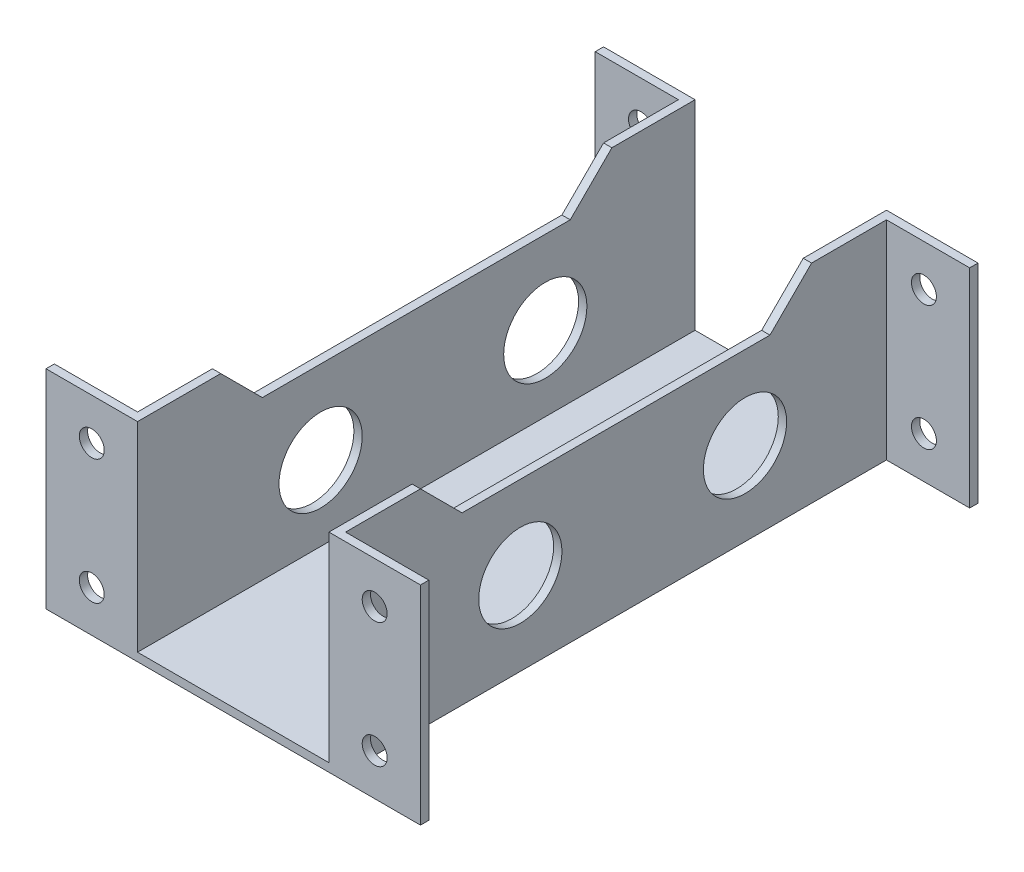
ISO-10303-21;
HEADER;
FILE_DESCRIPTION(('STEP AP214'),'2;1');
FILE_NAME('part.step','',(''),(''),'','','');
FILE_SCHEMA(('AUTOMOTIVE_DESIGN { 1 0 10303 214 1 1 1 1 }'));
ENDSEC;
DATA;
#1=APPLICATION_CONTEXT('core data for automotive mechanical design processes');
#2=APPLICATION_PROTOCOL_DEFINITION('international standard','automotive_design',2000,#1);
#3=PRODUCT_CONTEXT('',#1,'mechanical');
#4=PRODUCT('Part','Part','',(#3));
#5=PRODUCT_RELATED_PRODUCT_CATEGORY('part','',(#4));
#6=PRODUCT_DEFINITION_FORMATION('','',#4);
#7=PRODUCT_DEFINITION_CONTEXT('part definition',#1,'design');
#8=PRODUCT_DEFINITION('design','',#6,#7);
#9=PRODUCT_DEFINITION_SHAPE('','',#8);
#10=(LENGTH_UNIT() NAMED_UNIT(*) SI_UNIT(.MILLI.,.METRE.));
#11=(NAMED_UNIT(*) PLANE_ANGLE_UNIT() SI_UNIT($,.RADIAN.));
#12=(NAMED_UNIT(*) SI_UNIT($,.STERADIAN.) SOLID_ANGLE_UNIT());
#13=UNCERTAINTY_MEASURE_WITH_UNIT(LENGTH_MEASURE(1.E-05),#10,'distance_accuracy_value','');
#14=(GEOMETRIC_REPRESENTATION_CONTEXT(3) GLOBAL_UNCERTAINTY_ASSIGNED_CONTEXT((#13)) GLOBAL_UNIT_ASSIGNED_CONTEXT((#10,
#11,#12)) REPRESENTATION_CONTEXT('',''));
#15=CARTESIAN_POINT('',(0.,0.,0.));
#16=DIRECTION('',(0.,0.,1.));
#17=DIRECTION('',(1.,0.,0.));
#18=AXIS2_PLACEMENT_3D('',#15,#16,#17);
#19=CARTESIAN_POINT('',(0.,25.,0.));
#20=DIRECTION('',(0.,-1.,0.));
#21=DIRECTION('',(0.,0.,-1.));
#22=AXIS2_PLACEMENT_3D('',#19,#20,#21);
#23=PLANE('',#22);
#24=DIRECTION('',(0.,0.,-1.));
#25=VECTOR('',#24,1.);
#26=CARTESIAN_POINT('',(12.5,25.,-33.5));
#27=LINE('',#26,#25);
#28=CARTESIAN_POINT('',(12.5,25.,32.5));
#29=VERTEX_POINT('',#28);
#30=CARTESIAN_POINT('',(12.5,25.,23.5));
#31=VERTEX_POINT('',#30);
#32=EDGE_CURVE('E248',#29,#31,#27,.T.);
#33=ORIENTED_EDGE('',*,*,#32,.T.);
#34=DIRECTION('',(1.,0.,0.));
#35=VECTOR('',#34,1.);
#36=CARTESIAN_POINT('',(-22.500025,25.,23.5));
#37=LINE('',#36,#35);
#38=CARTESIAN_POINT('',(11.5,25.,23.5));
#39=VERTEX_POINT('',#38);
#40=EDGE_CURVE('E373',#39,#31,#37,.T.);
#41=ORIENTED_EDGE('',*,*,#40,.F.);
#42=DIRECTION('',(0.,0.,1.));
#43=VECTOR('',#42,1.);
#44=CARTESIAN_POINT('',(11.5,25.,-33.5));
#45=LINE('',#44,#43);
#46=CARTESIAN_POINT('',(11.5,25.,33.5));
#47=VERTEX_POINT('',#46);
#48=EDGE_CURVE('E489',#39,#47,#45,.T.);
#49=ORIENTED_EDGE('',*,*,#48,.T.);
#50=DIRECTION('',(1.,0.,0.));
#51=VECTOR('',#50,1.);
#52=CARTESIAN_POINT('',(12.5,25.,33.5));
#53=LINE('',#52,#51);
#54=CARTESIAN_POINT('',(22.5,25.,33.5));
#55=VERTEX_POINT('',#54);
#56=EDGE_CURVE('E357',#47,#55,#53,.T.);
#57=ORIENTED_EDGE('',*,*,#56,.T.);
#58=DIRECTION('',(0.,0.,1.));
#59=VECTOR('',#58,1.);
#60=CARTESIAN_POINT('',(22.5,25.,33.5));
#61=LINE('',#60,#59);
#62=CARTESIAN_POINT('',(22.5,25.,32.5));
#63=VERTEX_POINT('',#62);
#64=EDGE_CURVE('E275',#63,#55,#61,.T.);
#65=ORIENTED_EDGE('',*,*,#64,.F.);
#66=DIRECTION('',(-1.,0.,0.));
#67=VECTOR('',#66,1.);
#68=CARTESIAN_POINT('',(22.5,25.,32.5));
#69=LINE('',#68,#67);
#70=EDGE_CURVE('E271',#63,#29,#69,.T.);
#71=ORIENTED_EDGE('',*,*,#70,.T.);
#72=EDGE_LOOP('',(#33,#41,#49,#57,#65,#71));
#73=FACE_BOUND('',#72,.T.);
#74=ADVANCED_FACE('F32',(#73),#23,.F.);
#75=CARTESIAN_POINT('',(0.,25.,0.));
#76=DIRECTION('',(0.,1.,0.));
#77=DIRECTION('',(0.,0.,1.));
#78=AXIS2_PLACEMENT_3D('',#75,#76,#77);
#79=PLANE('',#78);
#80=DIRECTION('',(1.,0.,0.));
#81=VECTOR('',#80,1.);
#82=CARTESIAN_POINT('',(0.,25.,23.5));
#83=LINE('',#82,#81);
#84=CARTESIAN_POINT('',(-12.5,25.,23.5));
#85=VERTEX_POINT('',#84);
#86=CARTESIAN_POINT('',(-11.5,25.,23.5));
#87=VERTEX_POINT('',#86);
#88=EDGE_CURVE('E41',#85,#87,#83,.T.);
#89=ORIENTED_EDGE('',*,*,#88,.F.);
#90=DIRECTION('',(0.,0.,1.));
#91=VECTOR('',#90,1.);
#92=CARTESIAN_POINT('',(-12.5,25.,-33.5));
#93=LINE('',#92,#91);
#94=CARTESIAN_POINT('',(-12.5,25.,32.5));
#95=VERTEX_POINT('',#94);
#96=EDGE_CURVE('E220',#85,#95,#93,.T.);
#97=ORIENTED_EDGE('',*,*,#96,.T.);
#98=DIRECTION('',(1.,0.,0.));
#99=VECTOR('',#98,1.);
#100=CARTESIAN_POINT('',(-22.5,25.,32.5));
#101=LINE('',#100,#99);
#102=CARTESIAN_POINT('',(-22.5,25.,32.5));
#103=VERTEX_POINT('',#102);
#104=EDGE_CURVE('E315',#103,#95,#101,.T.);
#105=ORIENTED_EDGE('',*,*,#104,.F.);
#106=DIRECTION('',(0.,0.,-1.));
#107=VECTOR('',#106,1.);
#108=CARTESIAN_POINT('',(-22.5,25.,33.5));
#109=LINE('',#108,#107);
#110=CARTESIAN_POINT('',(-22.5,25.,33.5));
#111=VERTEX_POINT('',#110);
#112=EDGE_CURVE('E444',#111,#103,#109,.T.);
#113=ORIENTED_EDGE('',*,*,#112,.F.);
#114=DIRECTION('',(1.,0.,0.));
#115=VECTOR('',#114,1.);
#116=CARTESIAN_POINT('',(-12.5,25.,33.5));
#117=LINE('',#116,#115);
#118=CARTESIAN_POINT('',(-11.5,25.,33.5));
#119=VERTEX_POINT('',#118);
#120=EDGE_CURVE('E219',#111,#119,#117,.T.);
#121=ORIENTED_EDGE('',*,*,#120,.T.);
#122=DIRECTION('',(0.,0.,-1.));
#123=VECTOR('',#122,1.);
#124=CARTESIAN_POINT('',(-11.5,25.,-33.5));
#125=LINE('',#124,#123);
#126=EDGE_CURVE('E296',#119,#87,#125,.T.);
#127=ORIENTED_EDGE('',*,*,#126,.T.);
#128=EDGE_LOOP('',(#89,#97,#105,#113,#121,#127));
#129=FACE_BOUND('',#128,.T.);
#130=ADVANCED_FACE('F560',(#129),#79,.T.);
#131=CARTESIAN_POINT('',(-12.5,1.,33.5));
#132=DIRECTION('',(1.,0.,0.));
#133=DIRECTION('',(0.,0.,-1.));
#134=AXIS2_PLACEMENT_3D('',#131,#132,#133);
#135=PLANE('',#134);
#136=CARTESIAN_POINT('',(-12.5,10.,-15.5));
#137=DIRECTION('',(1.,0.,0.));
#138=DIRECTION('',(0.,0.,-1.));
#139=AXIS2_PLACEMENT_3D('',#136,#137,#138);
#140=CIRCLE('',#139,5.);
#141=CARTESIAN_POINT('',(-12.5,10.,-20.5));
#142=VERTEX_POINT('',#141);
#143=EDGE_CURVE('E536',#142,#142,#140,.T.);
#144=ORIENTED_EDGE('',*,*,#143,.T.);
#145=EDGE_LOOP('',(#144));
#146=FACE_BOUND('',#145,.T.);
#147=CARTESIAN_POINT('',(-12.5,10.,11.5));
#148=DIRECTION('',(1.,0.,0.));
#149=DIRECTION('',(0.,0.,-1.));
#150=AXIS2_PLACEMENT_3D('',#147,#148,#149);
#151=CIRCLE('',#150,5.);
#152=CARTESIAN_POINT('',(-12.5,10.,6.49999999999999));
#153=VERTEX_POINT('',#152);
#154=EDGE_CURVE('E518',#153,#153,#151,.T.);
#155=ORIENTED_EDGE('',*,*,#154,.T.);
#156=EDGE_LOOP('',(#155));
#157=FACE_BOUND('',#156,.T.);
#158=ORIENTED_EDGE('',*,*,#96,.F.);
#159=DIRECTION('',(0.,-0.707106781186549,-0.707106781186546));
#160=VECTOR('',#159,1.);
#161=CARTESIAN_POINT('',(-12.5,18.,16.5));
#162=LINE('',#161,#160);
#163=CARTESIAN_POINT('',(-12.5,20.,18.5));
#164=VERTEX_POINT('',#163);
#165=EDGE_CURVE('E383',#85,#164,#162,.T.);
#166=ORIENTED_EDGE('',*,*,#165,.T.);
#167=DIRECTION('',(0.,0.,-1.));
#168=VECTOR('',#167,1.);
#169=CARTESIAN_POINT('',(-12.5,20.,33.5));
#170=LINE('',#169,#168);
#171=CARTESIAN_POINT('',(-12.5,20.,-18.5));
#172=VERTEX_POINT('',#171);
#173=EDGE_CURVE('E211',#164,#172,#170,.T.);
#174=ORIENTED_EDGE('',*,*,#173,.T.);
#175=DIRECTION('',(0.,0.707106781186546,-0.707106781186549));
#176=VECTOR('',#175,1.);
#177=CARTESIAN_POINT('',(-12.5,-15.5,17.0000000000001));
#178=LINE('',#177,#176);
#179=CARTESIAN_POINT('',(-12.5,25.,-23.5));
#180=VERTEX_POINT('',#179);
#181=EDGE_CURVE('E197',#172,#180,#178,.T.);
#182=ORIENTED_EDGE('',*,*,#181,.T.);
#183=CARTESIAN_POINT('',(-12.5,25.,-32.5));
#184=VERTEX_POINT('',#183);
#185=EDGE_CURVE('E208',#184,#180,#93,.T.);
#186=ORIENTED_EDGE('',*,*,#185,.F.);
#187=DIRECTION('',(0.,1.,0.));
#188=VECTOR('',#187,1.);
#189=CARTESIAN_POINT('',(-12.5,25.,-32.5));
#190=LINE('',#189,#188);
#191=CARTESIAN_POINT('',(-12.5,0.,-32.5));
#192=VERTEX_POINT('',#191);
#193=EDGE_CURVE('E232',#192,#184,#190,.T.);
#194=ORIENTED_EDGE('',*,*,#193,.F.);
#195=DIRECTION('',(0.,0.,1.));
#196=VECTOR('',#195,1.);
#197=CARTESIAN_POINT('',(-12.5,0.,33.5));
#198=LINE('',#197,#196);
#199=CARTESIAN_POINT('',(-12.5,0.,32.5));
#200=VERTEX_POINT('',#199);
#201=EDGE_CURVE('E229',#192,#200,#198,.T.);
#202=ORIENTED_EDGE('',*,*,#201,.T.);
#203=DIRECTION('',(0.,-1.,0.));
#204=VECTOR('',#203,1.);
#205=CARTESIAN_POINT('',(-12.5,25.,32.5));
#206=LINE('',#205,#204);
#207=EDGE_CURVE('E445',#95,#200,#206,.T.);
#208=ORIENTED_EDGE('',*,*,#207,.F.);
#209=EDGE_LOOP('',(#158,#166,#174,#182,#186,#194,#202,#208));
#210=FACE_BOUND('',#209,.T.);
#211=ADVANCED_FACE('F207',(#146,#157,#210),#135,.F.);
#212=CARTESIAN_POINT('',(12.5,1.,33.5));
#213=DIRECTION('',(-1.,0.,0.));
#214=DIRECTION('',(0.,0.,1.));
#215=AXIS2_PLACEMENT_3D('',#212,#213,#214);
#216=PLANE('',#215);
#217=CARTESIAN_POINT('',(12.5,10.,-15.5));
#218=DIRECTION('',(1.,0.,0.));
#219=DIRECTION('',(0.,0.,-1.));
#220=AXIS2_PLACEMENT_3D('',#217,#218,#219);
#221=CIRCLE('',#220,5.);
#222=CARTESIAN_POINT('',(12.5,10.,-20.5));
#223=VERTEX_POINT('',#222);
#224=EDGE_CURVE('E542',#223,#223,#221,.T.);
#225=ORIENTED_EDGE('',*,*,#224,.F.);
#226=EDGE_LOOP('',(#225));
#227=FACE_BOUND('',#226,.T.);
#228=CARTESIAN_POINT('',(12.5,10.,11.5));
#229=DIRECTION('',(1.,0.,0.));
#230=DIRECTION('',(0.,0.,-1.));
#231=AXIS2_PLACEMENT_3D('',#228,#229,#230);
#232=CIRCLE('',#231,5.);
#233=CARTESIAN_POINT('',(12.5,10.,6.49999999999999));
#234=VERTEX_POINT('',#233);
#235=EDGE_CURVE('E532',#234,#234,#232,.T.);
#236=ORIENTED_EDGE('',*,*,#235,.F.);
#237=EDGE_LOOP('',(#236));
#238=FACE_BOUND('',#237,.T.);
#239=DIRECTION('',(0.,0.,1.));
#240=VECTOR('',#239,1.);
#241=CARTESIAN_POINT('',(12.5,20.,33.5));
#242=LINE('',#241,#240);
#243=CARTESIAN_POINT('',(12.5,20.,-18.5));
#244=VERTEX_POINT('',#243);
#245=CARTESIAN_POINT('',(12.5,20.,18.5));
#246=VERTEX_POINT('',#245);
#247=EDGE_CURVE('E379',#244,#246,#242,.T.);
#248=ORIENTED_EDGE('',*,*,#247,.T.);
#249=DIRECTION('',(0.,0.707106781186549,0.707106781186546));
#250=VECTOR('',#249,1.);
#251=CARTESIAN_POINT('',(12.5,18.,16.5));
#252=LINE('',#251,#250);
#253=EDGE_CURVE('E378',#246,#31,#252,.T.);
#254=ORIENTED_EDGE('',*,*,#253,.T.);
#255=ORIENTED_EDGE('',*,*,#32,.F.);
#256=DIRECTION('',(0.,1.,0.));
#257=VECTOR('',#256,1.);
#258=CARTESIAN_POINT('',(12.5,25.,32.5));
#259=LINE('',#258,#257);
#260=CARTESIAN_POINT('',(12.5,0.,32.5));
#261=VERTEX_POINT('',#260);
#262=EDGE_CURVE('E266',#261,#29,#259,.T.);
#263=ORIENTED_EDGE('',*,*,#262,.F.);
#264=DIRECTION('',(0.,0.,-1.));
#265=VECTOR('',#264,1.);
#266=CARTESIAN_POINT('',(12.5,0.,33.5));
#267=LINE('',#266,#265);
#268=CARTESIAN_POINT('',(12.5,0.,-32.5));
#269=VERTEX_POINT('',#268);
#270=EDGE_CURVE('E263',#261,#269,#267,.T.);
#271=ORIENTED_EDGE('',*,*,#270,.T.);
#272=DIRECTION('',(0.,-1.,0.));
#273=VECTOR('',#272,1.);
#274=CARTESIAN_POINT('',(12.5,25.,-32.5));
#275=LINE('',#274,#273);
#276=CARTESIAN_POINT('',(12.5,25.,-32.5));
#277=VERTEX_POINT('',#276);
#278=EDGE_CURVE('E327',#277,#269,#275,.T.);
#279=ORIENTED_EDGE('',*,*,#278,.F.);
#280=CARTESIAN_POINT('',(12.5,25.,-23.5));
#281=VERTEX_POINT('',#280);
#282=EDGE_CURVE('E246',#281,#277,#27,.T.);
#283=ORIENTED_EDGE('',*,*,#282,.F.);
#284=DIRECTION('',(0.,-0.707106781186546,0.707106781186549));
#285=VECTOR('',#284,1.);
#286=CARTESIAN_POINT('',(12.5,-15.5,17.0000000000001));
#287=LINE('',#286,#285);
#288=EDGE_CURVE('E49',#281,#244,#287,.T.);
#289=ORIENTED_EDGE('',*,*,#288,.T.);
#290=EDGE_LOOP('',(#248,#254,#255,#263,#271,#279,#283,#289));
#291=FACE_BOUND('',#290,.T.);
#292=ADVANCED_FACE('F34',(#227,#238,#291),#216,.F.);
#293=CARTESIAN_POINT('',(0.,1.,0.));
#294=DIRECTION('',(0.,-1.,0.));
#295=DIRECTION('',(0.,0.,-1.));
#296=AXIS2_PLACEMENT_3D('',#293,#294,#295);
#297=PLANE('',#296);
#298=CARTESIAN_POINT('',(0.,1.,-15.5));
#299=DIRECTION('',(0.,1.,0.));
#300=DIRECTION('',(0.,0.,1.));
#301=AXIS2_PLACEMENT_3D('',#298,#299,#300);
#302=CIRCLE('',#301,5.);
#303=CARTESIAN_POINT('',(0.,1.,-10.5));
#304=VERTEX_POINT('',#303);
#305=EDGE_CURVE('E435',#304,#304,#302,.T.);
#306=ORIENTED_EDGE('',*,*,#305,.F.);
#307=EDGE_LOOP('',(#306));
#308=FACE_BOUND('',#307,.T.);
#309=CARTESIAN_POINT('',(0.,1.,11.5));
#310=DIRECTION('',(0.,1.,0.));
#311=DIRECTION('',(0.,0.,1.));
#312=AXIS2_PLACEMENT_3D('',#309,#310,#311);
#313=CIRCLE('',#312,5.);
#314=CARTESIAN_POINT('',(0.,1.,16.5));
#315=VERTEX_POINT('',#314);
#316=EDGE_CURVE('E439',#315,#315,#313,.T.);
#317=ORIENTED_EDGE('',*,*,#316,.F.);
#318=EDGE_LOOP('',(#317));
#319=FACE_BOUND('',#318,.T.);
#320=DIRECTION('',(0.,0.,-1.));
#321=VECTOR('',#320,1.);
#322=CARTESIAN_POINT('',(-11.5,1.,-33.5));
#323=LINE('',#322,#321);
#324=CARTESIAN_POINT('',(-11.5,1.,33.5));
#325=VERTEX_POINT('',#324);
#326=CARTESIAN_POINT('',(-11.5,1.,-33.5));
#327=VERTEX_POINT('',#326);
#328=EDGE_CURVE('E224',#325,#327,#323,.T.);
#329=ORIENTED_EDGE('',*,*,#328,.F.);
#330=DIRECTION('',(1.,0.,0.));
#331=VECTOR('',#330,1.);
#332=CARTESIAN_POINT('',(-12.5,1.,33.5));
#333=LINE('',#332,#331);
#334=CARTESIAN_POINT('',(11.5,1.,33.5));
#335=VERTEX_POINT('',#334);
#336=EDGE_CURVE('E202',#325,#335,#333,.T.);
#337=ORIENTED_EDGE('',*,*,#336,.T.);
#338=DIRECTION('',(0.,0.,1.));
#339=VECTOR('',#338,1.);
#340=CARTESIAN_POINT('',(11.5,1.,-33.5));
#341=LINE('',#340,#339);
#342=CARTESIAN_POINT('',(11.5,1.,-33.5));
#343=VERTEX_POINT('',#342);
#344=EDGE_CURVE('E249',#343,#335,#341,.T.);
#345=ORIENTED_EDGE('',*,*,#344,.F.);
#346=DIRECTION('',(-1.,0.,0.));
#347=VECTOR('',#346,1.);
#348=CARTESIAN_POINT('',(-12.5,1.,-33.5));
#349=LINE('',#348,#347);
#350=EDGE_CURVE('E366',#343,#327,#349,.T.);
#351=ORIENTED_EDGE('',*,*,#350,.T.);
#352=EDGE_LOOP('',(#329,#337,#345,#351));
#353=FACE_BOUND('',#352,.T.);
#354=ADVANCED_FACE('F566',(#308,#319,#353),#297,.F.);
#355=CARTESIAN_POINT('',(-12.5,1.,-33.5));
#356=DIRECTION('',(0.,0.,1.));
#357=DIRECTION('',(1.,0.,0.));
#358=AXIS2_PLACEMENT_3D('',#355,#356,#357);
#359=PLANE('',#358);
#360=CARTESIAN_POINT('',(17.,20.,-33.5));
#361=DIRECTION('',(0.,0.,1.));
#362=DIRECTION('',(1.,0.,0.));
#363=AXIS2_PLACEMENT_3D('',#360,#361,#362);
#364=CIRCLE('',#363,1.5);
#365=CARTESIAN_POINT('',(18.5,20.,-33.5));
#366=VERTEX_POINT('',#365);
#367=EDGE_CURVE('E402',#366,#366,#364,.T.);
#368=ORIENTED_EDGE('',*,*,#367,.T.);
#369=EDGE_LOOP('',(#368));
#370=FACE_BOUND('',#369,.T.);
#371=CARTESIAN_POINT('',(17.,5.,-33.5));
#372=DIRECTION('',(0.,0.,1.));
#373=DIRECTION('',(1.,0.,0.));
#374=AXIS2_PLACEMENT_3D('',#371,#372,#373);
#375=CIRCLE('',#374,1.5);
#376=CARTESIAN_POINT('',(18.5,5.,-33.5));
#377=VERTEX_POINT('',#376);
#378=EDGE_CURVE('E412',#377,#377,#375,.T.);
#379=ORIENTED_EDGE('',*,*,#378,.T.);
#380=EDGE_LOOP('',(#379));
#381=FACE_BOUND('',#380,.T.);
#382=CARTESIAN_POINT('',(-17.,20.,-33.5));
#383=DIRECTION('',(0.,0.,1.));
#384=DIRECTION('',(1.,0.,0.));
#385=AXIS2_PLACEMENT_3D('',#382,#383,#384);
#386=CIRCLE('',#385,1.5);
#387=CARTESIAN_POINT('',(-15.5,20.,-33.5));
#388=VERTEX_POINT('',#387);
#389=EDGE_CURVE('E422',#388,#388,#386,.T.);
#390=ORIENTED_EDGE('',*,*,#389,.T.);
#391=EDGE_LOOP('',(#390));
#392=FACE_BOUND('',#391,.T.);
#393=CARTESIAN_POINT('',(-17.,5.,-33.5));
#394=DIRECTION('',(0.,0.,1.));
#395=DIRECTION('',(1.,0.,0.));
#396=AXIS2_PLACEMENT_3D('',#393,#394,#395);
#397=CIRCLE('',#396,1.5);
#398=CARTESIAN_POINT('',(-15.5,5.,-33.5));
#399=VERTEX_POINT('',#398);
#400=EDGE_CURVE('E432',#399,#399,#397,.T.);
#401=ORIENTED_EDGE('',*,*,#400,.T.);
#402=EDGE_LOOP('',(#401));
#403=FACE_BOUND('',#402,.T.);
#404=DIRECTION('',(-1.,0.,0.));
#405=VECTOR('',#404,1.);
#406=CARTESIAN_POINT('',(-12.5,0.,-33.5));
#407=LINE('',#406,#405);
#408=CARTESIAN_POINT('',(22.5,0.,-33.5));
#409=VERTEX_POINT('',#408);
#410=CARTESIAN_POINT('',(-22.5,0.,-33.5));
#411=VERTEX_POINT('',#410);
#412=EDGE_CURVE('E308',#409,#411,#407,.T.);
#413=ORIENTED_EDGE('',*,*,#412,.T.);
#414=DIRECTION('',(0.,-1.,0.));
#415=VECTOR('',#414,1.);
#416=CARTESIAN_POINT('',(-22.5,25.,-33.5));
#417=LINE('',#416,#415);
#418=CARTESIAN_POINT('',(-22.5,25.,-33.5));
#419=VERTEX_POINT('',#418);
#420=EDGE_CURVE('E306',#419,#411,#417,.T.);
#421=ORIENTED_EDGE('',*,*,#420,.F.);
#422=DIRECTION('',(-1.,0.,0.));
#423=VECTOR('',#422,1.);
#424=CARTESIAN_POINT('',(-12.5,25.,-33.5));
#425=LINE('',#424,#423);
#426=CARTESIAN_POINT('',(-11.5,25.,-33.5));
#427=VERTEX_POINT('',#426);
#428=EDGE_CURVE('E291',#427,#419,#425,.T.);
#429=ORIENTED_EDGE('',*,*,#428,.F.);
#430=DIRECTION('',(0.,-1.,0.));
#431=VECTOR('',#430,1.);
#432=CARTESIAN_POINT('',(-11.5,25.,-33.5));
#433=LINE('',#432,#431);
#434=EDGE_CURVE('E292',#427,#327,#433,.T.);
#435=ORIENTED_EDGE('',*,*,#434,.T.);
#436=ORIENTED_EDGE('',*,*,#350,.F.);
#437=DIRECTION('',(0.,-1.,0.));
#438=VECTOR('',#437,1.);
#439=CARTESIAN_POINT('',(11.5,25.,-33.5));
#440=LINE('',#439,#438);
#441=CARTESIAN_POINT('',(11.5,25.,-33.5));
#442=VERTEX_POINT('',#441);
#443=EDGE_CURVE('E466',#442,#343,#440,.T.);
#444=ORIENTED_EDGE('',*,*,#443,.F.);
#445=DIRECTION('',(-1.,0.,0.));
#446=VECTOR('',#445,1.);
#447=CARTESIAN_POINT('',(12.5,25.,-33.5));
#448=LINE('',#447,#446);
#449=CARTESIAN_POINT('',(22.5,25.,-33.5));
#450=VERTEX_POINT('',#449);
#451=EDGE_CURVE('E256',#450,#442,#448,.T.);
#452=ORIENTED_EDGE('',*,*,#451,.F.);
#453=DIRECTION('',(0.,1.,0.));
#454=VECTOR('',#453,1.);
#455=CARTESIAN_POINT('',(22.5,25.,-33.5));
#456=LINE('',#455,#454);
#457=EDGE_CURVE('E323',#409,#450,#456,.T.);
#458=ORIENTED_EDGE('',*,*,#457,.F.);
#459=EDGE_LOOP('',(#413,#421,#429,#435,#436,#444,#452,#458));
#460=FACE_BOUND('',#459,.T.);
#461=ADVANCED_FACE('F304',(#370,#381,#392,#403,#460),#359,.F.);
#462=CARTESIAN_POINT('',(-12.5,1.,33.5));
#463=DIRECTION('',(0.,0.,-1.));
#464=DIRECTION('',(-1.,0.,0.));
#465=AXIS2_PLACEMENT_3D('',#462,#463,#464);
#466=PLANE('',#465);
#467=CARTESIAN_POINT('',(17.,20.,33.5));
#468=DIRECTION('',(0.,0.,1.));
#469=DIRECTION('',(1.,0.,0.));
#470=AXIS2_PLACEMENT_3D('',#467,#468,#469);
#471=CIRCLE('',#470,1.5);
#472=CARTESIAN_POINT('',(18.5,20.,33.5));
#473=VERTEX_POINT('',#472);
#474=EDGE_CURVE('E396',#473,#473,#471,.T.);
#475=ORIENTED_EDGE('',*,*,#474,.F.);
#476=EDGE_LOOP('',(#475));
#477=FACE_BOUND('',#476,.T.);
#478=CARTESIAN_POINT('',(17.,5.,33.5));
#479=DIRECTION('',(0.,0.,1.));
#480=DIRECTION('',(1.,0.,0.));
#481=AXIS2_PLACEMENT_3D('',#478,#479,#480);
#482=CIRCLE('',#481,1.5);
#483=CARTESIAN_POINT('',(18.5,5.,33.5));
#484=VERTEX_POINT('',#483);
#485=EDGE_CURVE('E405',#484,#484,#482,.T.);
#486=ORIENTED_EDGE('',*,*,#485,.F.);
#487=EDGE_LOOP('',(#486));
#488=FACE_BOUND('',#487,.T.);
#489=CARTESIAN_POINT('',(-17.,20.,33.5));
#490=DIRECTION('',(0.,0.,1.));
#491=DIRECTION('',(1.,0.,0.));
#492=AXIS2_PLACEMENT_3D('',#489,#490,#491);
#493=CIRCLE('',#492,1.5);
#494=CARTESIAN_POINT('',(-15.5,20.,33.5));
#495=VERTEX_POINT('',#494);
#496=EDGE_CURVE('E415',#495,#495,#493,.T.);
#497=ORIENTED_EDGE('',*,*,#496,.F.);
#498=EDGE_LOOP('',(#497));
#499=FACE_BOUND('',#498,.T.);
#500=CARTESIAN_POINT('',(-17.,5.,33.5));
#501=DIRECTION('',(0.,0.,1.));
#502=DIRECTION('',(1.,0.,0.));
#503=AXIS2_PLACEMENT_3D('',#500,#501,#502);
#504=CIRCLE('',#503,1.5);
#505=CARTESIAN_POINT('',(-15.5,5.,33.5));
#506=VERTEX_POINT('',#505);
#507=EDGE_CURVE('E425',#506,#506,#504,.T.);
#508=ORIENTED_EDGE('',*,*,#507,.F.);
#509=EDGE_LOOP('',(#508));
#510=FACE_BOUND('',#509,.T.);
#511=DIRECTION('',(1.,0.,0.));
#512=VECTOR('',#511,1.);
#513=CARTESIAN_POINT('',(-12.5,0.,33.5));
#514=LINE('',#513,#512);
#515=CARTESIAN_POINT('',(-22.5,0.,33.5));
#516=VERTEX_POINT('',#515);
#517=CARTESIAN_POINT('',(22.5,0.,33.5));
#518=VERTEX_POINT('',#517);
#519=EDGE_CURVE('E359',#516,#518,#514,.T.);
#520=ORIENTED_EDGE('',*,*,#519,.T.);
#521=DIRECTION('',(0.,-1.,0.));
#522=VECTOR('',#521,1.);
#523=CARTESIAN_POINT('',(22.5,25.,33.5));
#524=LINE('',#523,#522);
#525=EDGE_CURVE('E269',#55,#518,#524,.T.);
#526=ORIENTED_EDGE('',*,*,#525,.F.);
#527=ORIENTED_EDGE('',*,*,#56,.F.);
#528=DIRECTION('',(0.,-1.,0.));
#529=VECTOR('',#528,1.);
#530=CARTESIAN_POINT('',(11.5,25.,33.5));
#531=LINE('',#530,#529);
#532=EDGE_CURVE('E484',#47,#335,#531,.T.);
#533=ORIENTED_EDGE('',*,*,#532,.T.);
#534=ORIENTED_EDGE('',*,*,#336,.F.);
#535=DIRECTION('',(0.,-1.,0.));
#536=VECTOR('',#535,1.);
#537=CARTESIAN_POINT('',(-11.5,25.,33.5));
#538=LINE('',#537,#536);
#539=EDGE_CURVE('E254',#119,#325,#538,.T.);
#540=ORIENTED_EDGE('',*,*,#539,.F.);
#541=ORIENTED_EDGE('',*,*,#120,.F.);
#542=DIRECTION('',(0.,1.,0.));
#543=VECTOR('',#542,1.);
#544=CARTESIAN_POINT('',(-22.5,25.,33.5));
#545=LINE('',#544,#543);
#546=EDGE_CURVE('E362',#516,#111,#545,.T.);
#547=ORIENTED_EDGE('',*,*,#546,.F.);
#548=EDGE_LOOP('',(#520,#526,#527,#533,#534,#540,#541,#547));
#549=FACE_BOUND('',#548,.T.);
#550=ADVANCED_FACE('F355',(#477,#488,#499,#510,#549),#466,.F.);
#551=CARTESIAN_POINT('',(0.,0.,0.));
#552=DIRECTION('',(0.,-1.,0.));
#553=DIRECTION('',(0.,0.,-1.));
#554=AXIS2_PLACEMENT_3D('',#551,#552,#553);
#555=PLANE('',#554);
#556=CARTESIAN_POINT('',(0.,0.,-15.5));
#557=DIRECTION('',(0.,-1.,0.));
#558=DIRECTION('',(0.,0.,-1.));
#559=AXIS2_PLACEMENT_3D('',#556,#557,#558);
#560=CIRCLE('',#559,5.);
#561=CARTESIAN_POINT('',(0.,0.,-20.5));
#562=VERTEX_POINT('',#561);
#563=EDGE_CURVE('E438',#562,#562,#560,.T.);
#564=ORIENTED_EDGE('',*,*,#563,.F.);
#565=EDGE_LOOP('',(#564));
#566=FACE_BOUND('',#565,.T.);
#567=CARTESIAN_POINT('',(0.,0.,11.5));
#568=DIRECTION('',(0.,-1.,0.));
#569=DIRECTION('',(0.,0.,-1.));
#570=AXIS2_PLACEMENT_3D('',#567,#568,#569);
#571=CIRCLE('',#570,5.);
#572=CARTESIAN_POINT('',(0.,0.,6.49999999999999));
#573=VERTEX_POINT('',#572);
#574=EDGE_CURVE('E442',#573,#573,#571,.T.);
#575=ORIENTED_EDGE('',*,*,#574,.F.);
#576=EDGE_LOOP('',(#575));
#577=FACE_BOUND('',#576,.T.);
#578=ORIENTED_EDGE('',*,*,#270,.F.);
#579=DIRECTION('',(-1.,0.,0.));
#580=VECTOR('',#579,1.);
#581=CARTESIAN_POINT('',(22.5,0.,32.5));
#582=LINE('',#581,#580);
#583=CARTESIAN_POINT('',(22.5,0.,32.5));
#584=VERTEX_POINT('',#583);
#585=EDGE_CURVE('E274',#584,#261,#582,.T.);
#586=ORIENTED_EDGE('',*,*,#585,.F.);
#587=DIRECTION('',(0.,0.,-1.));
#588=VECTOR('',#587,1.);
#589=CARTESIAN_POINT('',(22.5,0.,33.5));
#590=LINE('',#589,#588);
#591=EDGE_CURVE('E343',#518,#584,#590,.T.);
#592=ORIENTED_EDGE('',*,*,#591,.F.);
#593=ORIENTED_EDGE('',*,*,#519,.F.);
#594=DIRECTION('',(0.,0.,1.));
#595=VECTOR('',#594,1.);
#596=CARTESIAN_POINT('',(-22.5,0.,33.5));
#597=LINE('',#596,#595);
#598=CARTESIAN_POINT('',(-22.5,0.,32.5));
#599=VERTEX_POINT('',#598);
#600=EDGE_CURVE('E449',#599,#516,#597,.T.);
#601=ORIENTED_EDGE('',*,*,#600,.F.);
#602=DIRECTION('',(1.,0.,0.));
#603=VECTOR('',#602,1.);
#604=CARTESIAN_POINT('',(-22.5,0.,32.5));
#605=LINE('',#604,#603);
#606=EDGE_CURVE('E451',#599,#200,#605,.T.);
#607=ORIENTED_EDGE('',*,*,#606,.T.);
#608=ORIENTED_EDGE('',*,*,#201,.F.);
#609=DIRECTION('',(1.,0.,0.));
#610=VECTOR('',#609,1.);
#611=CARTESIAN_POINT('',(-22.5,0.,-32.5));
#612=LINE('',#611,#610);
#613=CARTESIAN_POINT('',(-22.5,0.,-32.5));
#614=VERTEX_POINT('',#613);
#615=EDGE_CURVE('E336',#614,#192,#612,.T.);
#616=ORIENTED_EDGE('',*,*,#615,.F.);
#617=DIRECTION('',(0.,0.,1.));
#618=VECTOR('',#617,1.);
#619=CARTESIAN_POINT('',(-22.5,0.,-33.5));
#620=LINE('',#619,#618);
#621=EDGE_CURVE('E311',#411,#614,#620,.T.);
#622=ORIENTED_EDGE('',*,*,#621,.F.);
#623=ORIENTED_EDGE('',*,*,#412,.F.);
#624=DIRECTION('',(0.,0.,-1.));
#625=VECTOR('',#624,1.);
#626=CARTESIAN_POINT('',(22.5,0.,-33.5));
#627=LINE('',#626,#625);
#628=CARTESIAN_POINT('',(22.5,0.,-32.5));
#629=VERTEX_POINT('',#628);
#630=EDGE_CURVE('E331',#629,#409,#627,.T.);
#631=ORIENTED_EDGE('',*,*,#630,.F.);
#632=DIRECTION('',(-1.,0.,0.));
#633=VECTOR('',#632,1.);
#634=CARTESIAN_POINT('',(22.5,0.,-32.5));
#635=LINE('',#634,#633);
#636=EDGE_CURVE('E334',#629,#269,#635,.T.);
#637=ORIENTED_EDGE('',*,*,#636,.T.);
#638=EDGE_LOOP('',(#578,#586,#592,#593,#601,#607,#608,#616,#622,#623,#631,#637));
#639=FACE_BOUND('',#638,.T.);
#640=ADVANCED_FACE('F369',(#566,#577,#639),#555,.T.);
#641=CARTESIAN_POINT('',(11.5,25.,-33.5));
#642=DIRECTION('',(1.,0.,0.));
#643=DIRECTION('',(0.,0.,-1.));
#644=AXIS2_PLACEMENT_3D('',#641,#642,#643);
#645=PLANE('',#644);
#646=CARTESIAN_POINT('',(11.5,10.,-15.5));
#647=DIRECTION('',(1.,0.,0.));
#648=DIRECTION('',(0.,0.,-1.));
#649=AXIS2_PLACEMENT_3D('',#646,#647,#648);
#650=CIRCLE('',#649,5.);
#651=CARTESIAN_POINT('',(11.5,10.,-20.5));
#652=VERTEX_POINT('',#651);
#653=EDGE_CURVE('E539',#652,#652,#650,.T.);
#654=ORIENTED_EDGE('',*,*,#653,.T.);
#655=EDGE_LOOP('',(#654));
#656=FACE_BOUND('',#655,.T.);
#657=CARTESIAN_POINT('',(11.5,10.,11.5));
#658=DIRECTION('',(1.,0.,0.));
#659=DIRECTION('',(0.,0.,-1.));
#660=AXIS2_PLACEMENT_3D('',#657,#658,#659);
#661=CIRCLE('',#660,5.);
#662=CARTESIAN_POINT('',(11.5,10.,6.49999999999999));
#663=VERTEX_POINT('',#662);
#664=EDGE_CURVE('E525',#663,#663,#661,.T.);
#665=ORIENTED_EDGE('',*,*,#664,.T.);
#666=EDGE_LOOP('',(#665));
#667=FACE_BOUND('',#666,.T.);
#668=ORIENTED_EDGE('',*,*,#48,.F.);
#669=DIRECTION('',(0.,-0.707106781186549,-0.707106781186546));
#670=VECTOR('',#669,1.);
#671=CARTESIAN_POINT('',(11.5,-3.50000000000001,-4.99999999999991));
#672=LINE('',#671,#670);
#673=CARTESIAN_POINT('',(11.5,20.,18.5));
#674=VERTEX_POINT('',#673);
#675=EDGE_CURVE('E384',#39,#674,#672,.T.);
#676=ORIENTED_EDGE('',*,*,#675,.T.);
#677=DIRECTION('',(0.,0.,-1.));
#678=VECTOR('',#677,1.);
#679=CARTESIAN_POINT('',(11.5,20.,-33.5));
#680=LINE('',#679,#678);
#681=CARTESIAN_POINT('',(11.5,20.,-18.5));
#682=VERTEX_POINT('',#681);
#683=EDGE_CURVE('E386',#674,#682,#680,.T.);
#684=ORIENTED_EDGE('',*,*,#683,.T.);
#685=DIRECTION('',(0.,0.707106781186546,-0.707106781186549));
#686=VECTOR('',#685,1.);
#687=CARTESIAN_POINT('',(11.5,30.,-28.5));
#688=LINE('',#687,#686);
#689=CARTESIAN_POINT('',(11.5,25.,-23.5));
#690=VERTEX_POINT('',#689);
#691=EDGE_CURVE('E500',#682,#690,#688,.T.);
#692=ORIENTED_EDGE('',*,*,#691,.T.);
#693=EDGE_CURVE('E487',#442,#690,#45,.T.);
#694=ORIENTED_EDGE('',*,*,#693,.F.);
#695=ORIENTED_EDGE('',*,*,#443,.T.);
#696=ORIENTED_EDGE('',*,*,#344,.T.);
#697=ORIENTED_EDGE('',*,*,#532,.F.);
#698=EDGE_LOOP('',(#668,#676,#684,#692,#694,#695,#696,#697));
#699=FACE_BOUND('',#698,.T.);
#700=ADVANCED_FACE('F499',(#656,#667,#699),#645,.F.);
#701=ORIENTED_EDGE('',*,*,#693,.T.);
#702=DIRECTION('',(1.,0.,0.));
#703=VECTOR('',#702,1.);
#704=CARTESIAN_POINT('',(-22.500025,25.,-23.5));
#705=LINE('',#704,#703);
#706=EDGE_CURVE('E521',#690,#281,#705,.T.);
#707=ORIENTED_EDGE('',*,*,#706,.T.);
#708=ORIENTED_EDGE('',*,*,#282,.T.);
#709=DIRECTION('',(-1.,0.,0.));
#710=VECTOR('',#709,1.);
#711=CARTESIAN_POINT('',(22.5,25.,-32.5));
#712=LINE('',#711,#710);
#713=CARTESIAN_POINT('',(22.5,25.,-32.5));
#714=VERTEX_POINT('',#713);
#715=EDGE_CURVE('E270',#714,#277,#712,.T.);
#716=ORIENTED_EDGE('',*,*,#715,.F.);
#717=DIRECTION('',(0.,0.,1.));
#718=VECTOR('',#717,1.);
#719=CARTESIAN_POINT('',(22.5,25.,-33.5));
#720=LINE('',#719,#718);
#721=EDGE_CURVE('E326',#450,#714,#720,.T.);
#722=ORIENTED_EDGE('',*,*,#721,.F.);
#723=ORIENTED_EDGE('',*,*,#451,.T.);
#724=EDGE_LOOP('',(#701,#707,#708,#716,#722,#723));
#725=FACE_BOUND('',#724,.T.);
#726=ADVANCED_FACE('F494',(#725),#23,.F.);
#727=CARTESIAN_POINT('',(-11.5,25.,-33.5));
#728=DIRECTION('',(-1.,0.,0.));
#729=DIRECTION('',(0.,0.,1.));
#730=AXIS2_PLACEMENT_3D('',#727,#728,#729);
#731=PLANE('',#730);
#732=CARTESIAN_POINT('',(-11.5,10.,-15.5));
#733=DIRECTION('',(-1.,0.,0.));
#734=DIRECTION('',(0.,0.,1.));
#735=AXIS2_PLACEMENT_3D('',#732,#733,#734);
#736=CIRCLE('',#735,5.);
#737=CARTESIAN_POINT('',(-11.5,10.,-10.5));
#738=VERTEX_POINT('',#737);
#739=EDGE_CURVE('E36',#738,#738,#736,.T.);
#740=ORIENTED_EDGE('',*,*,#739,.T.);
#741=EDGE_LOOP('',(#740));
#742=FACE_BOUND('',#741,.T.);
#743=CARTESIAN_POINT('',(-11.5,10.,11.5));
#744=DIRECTION('',(-1.,0.,0.));
#745=DIRECTION('',(0.,0.,1.));
#746=AXIS2_PLACEMENT_3D('',#743,#744,#745);
#747=CIRCLE('',#746,5.);
#748=CARTESIAN_POINT('',(-11.5,10.,16.5));
#749=VERTEX_POINT('',#748);
#750=EDGE_CURVE('E250',#749,#749,#747,.T.);
#751=ORIENTED_EDGE('',*,*,#750,.T.);
#752=EDGE_LOOP('',(#751));
#753=FACE_BOUND('',#752,.T.);
#754=DIRECTION('',(0.,0.,1.));
#755=VECTOR('',#754,1.);
#756=CARTESIAN_POINT('',(-11.5,20.,-33.5));
#757=LINE('',#756,#755);
#758=CARTESIAN_POINT('',(-11.5,20.,-18.5));
#759=VERTEX_POINT('',#758);
#760=CARTESIAN_POINT('',(-11.5,20.,18.5));
#761=VERTEX_POINT('',#760);
#762=EDGE_CURVE('E11',#759,#761,#757,.T.);
#763=ORIENTED_EDGE('',*,*,#762,.T.);
#764=DIRECTION('',(0.,0.707106781186549,0.707106781186546));
#765=VECTOR('',#764,1.);
#766=CARTESIAN_POINT('',(-11.5,-3.50000000000001,-4.99999999999991));
#767=LINE('',#766,#765);
#768=EDGE_CURVE('E212',#761,#87,#767,.T.);
#769=ORIENTED_EDGE('',*,*,#768,.T.);
#770=ORIENTED_EDGE('',*,*,#126,.F.);
#771=ORIENTED_EDGE('',*,*,#539,.T.);
#772=ORIENTED_EDGE('',*,*,#328,.T.);
#773=ORIENTED_EDGE('',*,*,#434,.F.);
#774=CARTESIAN_POINT('',(-11.5,25.,-23.5));
#775=VERTEX_POINT('',#774);
#776=EDGE_CURVE('E222',#775,#427,#125,.T.);
#777=ORIENTED_EDGE('',*,*,#776,.F.);
#778=DIRECTION('',(0.,-0.707106781186546,0.707106781186549));
#779=VECTOR('',#778,1.);
#780=CARTESIAN_POINT('',(-11.5,30.,-28.5));
#781=LINE('',#780,#779);
#782=EDGE_CURVE('E57',#775,#759,#781,.T.);
#783=ORIENTED_EDGE('',*,*,#782,.T.);
#784=EDGE_LOOP('',(#763,#769,#770,#771,#772,#773,#777,#783));
#785=FACE_BOUND('',#784,.T.);
#786=ADVANCED_FACE('F302',(#742,#753,#785),#731,.F.);
#787=DIRECTION('',(-1.,0.,0.));
#788=VECTOR('',#787,1.);
#789=CARTESIAN_POINT('',(0.,25.,-23.5));
#790=LINE('',#789,#788);
#791=EDGE_CURVE('E194',#775,#180,#790,.T.);
#792=ORIENTED_EDGE('',*,*,#791,.F.);
#793=ORIENTED_EDGE('',*,*,#776,.T.);
#794=ORIENTED_EDGE('',*,*,#428,.T.);
#795=DIRECTION('',(0.,0.,-1.));
#796=VECTOR('',#795,1.);
#797=CARTESIAN_POINT('',(-22.5,25.,-33.5));
#798=LINE('',#797,#796);
#799=CARTESIAN_POINT('',(-22.5,25.,-32.5));
#800=VERTEX_POINT('',#799);
#801=EDGE_CURVE('E320',#800,#419,#798,.T.);
#802=ORIENTED_EDGE('',*,*,#801,.F.);
#803=DIRECTION('',(1.,0.,0.));
#804=VECTOR('',#803,1.);
#805=CARTESIAN_POINT('',(-22.5,25.,-32.5));
#806=LINE('',#805,#804);
#807=EDGE_CURVE('E218',#800,#184,#806,.T.);
#808=ORIENTED_EDGE('',*,*,#807,.T.);
#809=ORIENTED_EDGE('',*,*,#185,.T.);
#810=EDGE_LOOP('',(#792,#793,#794,#802,#808,#809));
#811=FACE_BOUND('',#810,.T.);
#812=ADVANCED_FACE('F215',(#811),#79,.T.);
#813=CARTESIAN_POINT('',(22.5,25.,32.5));
#814=DIRECTION('',(0.,0.,1.));
#815=DIRECTION('',(1.,0.,0.));
#816=AXIS2_PLACEMENT_3D('',#813,#814,#815);
#817=PLANE('',#816);
#818=CARTESIAN_POINT('',(17.,20.,32.5));
#819=DIRECTION('',(0.,0.,1.));
#820=DIRECTION('',(1.,0.,0.));
#821=AXIS2_PLACEMENT_3D('',#818,#819,#820);
#822=CIRCLE('',#821,1.5);
#823=CARTESIAN_POINT('',(18.5,20.,32.5));
#824=VERTEX_POINT('',#823);
#825=EDGE_CURVE('E399',#824,#824,#822,.T.);
#826=ORIENTED_EDGE('',*,*,#825,.T.);
#827=EDGE_LOOP('',(#826));
#828=FACE_BOUND('',#827,.T.);
#829=CARTESIAN_POINT('',(17.,5.,32.5));
#830=DIRECTION('',(0.,0.,1.));
#831=DIRECTION('',(1.,0.,0.));
#832=AXIS2_PLACEMENT_3D('',#829,#830,#831);
#833=CIRCLE('',#832,1.5);
#834=CARTESIAN_POINT('',(18.5,5.,32.5));
#835=VERTEX_POINT('',#834);
#836=EDGE_CURVE('E409',#835,#835,#833,.T.);
#837=ORIENTED_EDGE('',*,*,#836,.T.);
#838=EDGE_LOOP('',(#837));
#839=FACE_BOUND('',#838,.T.);
#840=ORIENTED_EDGE('',*,*,#262,.T.);
#841=ORIENTED_EDGE('',*,*,#70,.F.);
#842=DIRECTION('',(0.,1.,0.));
#843=VECTOR('',#842,1.);
#844=CARTESIAN_POINT('',(22.5,25.,32.5));
#845=LINE('',#844,#843);
#846=EDGE_CURVE('E345',#584,#63,#845,.T.);
#847=ORIENTED_EDGE('',*,*,#846,.F.);
#848=ORIENTED_EDGE('',*,*,#585,.T.);
#849=EDGE_LOOP('',(#840,#841,#847,#848));
#850=FACE_BOUND('',#849,.T.);
#851=ADVANCED_FACE('F371',(#828,#839,#850),#817,.F.);
#852=CARTESIAN_POINT('',(22.5,0.,0.));
#853=DIRECTION('',(1.,0.,0.));
#854=DIRECTION('',(0.,0.,-1.));
#855=AXIS2_PLACEMENT_3D('',#852,#853,#854);
#856=PLANE('',#855);
#857=ORIENTED_EDGE('',*,*,#525,.T.);
#858=ORIENTED_EDGE('',*,*,#591,.T.);
#859=ORIENTED_EDGE('',*,*,#846,.T.);
#860=ORIENTED_EDGE('',*,*,#64,.T.);
#861=EDGE_LOOP('',(#857,#858,#859,#860));
#862=FACE_BOUND('',#861,.T.);
#863=ADVANCED_FACE('F350',(#862),#856,.T.);
#864=CARTESIAN_POINT('',(22.5,25.,-32.5));
#865=DIRECTION('',(0.,0.,-1.));
#866=DIRECTION('',(0.,1.,0.));
#867=AXIS2_PLACEMENT_3D('',#864,#865,#866);
#868=PLANE('',#867);
#869=CARTESIAN_POINT('',(17.,20.,-32.5));
#870=DIRECTION('',(0.,0.,-1.));
#871=DIRECTION('',(0.,1.,0.));
#872=AXIS2_PLACEMENT_3D('',#869,#870,#871);
#873=CIRCLE('',#872,1.5);
#874=CARTESIAN_POINT('',(17.,21.5,-32.5));
#875=VERTEX_POINT('',#874);
#876=EDGE_CURVE('E242',#875,#875,#873,.T.);
#877=ORIENTED_EDGE('',*,*,#876,.T.);
#878=EDGE_LOOP('',(#877));
#879=FACE_BOUND('',#878,.T.);
#880=CARTESIAN_POINT('',(17.,5.,-32.5));
#881=DIRECTION('',(0.,0.,-1.));
#882=DIRECTION('',(0.,1.,0.));
#883=AXIS2_PLACEMENT_3D('',#880,#881,#882);
#884=CIRCLE('',#883,1.5);
#885=CARTESIAN_POINT('',(17.,6.5,-32.5));
#886=VERTEX_POINT('',#885);
#887=EDGE_CURVE('E408',#886,#886,#884,.T.);
#888=ORIENTED_EDGE('',*,*,#887,.T.);
#889=EDGE_LOOP('',(#888));
#890=FACE_BOUND('',#889,.T.);
#891=ORIENTED_EDGE('',*,*,#278,.T.);
#892=ORIENTED_EDGE('',*,*,#636,.F.);
#893=DIRECTION('',(0.,-1.,0.));
#894=VECTOR('',#893,1.);
#895=CARTESIAN_POINT('',(22.5,25.,-32.5));
#896=LINE('',#895,#894);
#897=EDGE_CURVE('E329',#714,#629,#896,.T.);
#898=ORIENTED_EDGE('',*,*,#897,.F.);
#899=ORIENTED_EDGE('',*,*,#715,.T.);
#900=EDGE_LOOP('',(#891,#892,#898,#899));
#901=FACE_BOUND('',#900,.T.);
#902=ADVANCED_FACE('F621',(#879,#890,#901),#868,.F.);
#903=CARTESIAN_POINT('',(22.5,0.,0.));
#904=DIRECTION('',(-1.,0.,0.));
#905=DIRECTION('',(0.,0.,1.));
#906=AXIS2_PLACEMENT_3D('',#903,#904,#905);
#907=PLANE('',#906);
#908=ORIENTED_EDGE('',*,*,#457,.T.);
#909=ORIENTED_EDGE('',*,*,#721,.T.);
#910=ORIENTED_EDGE('',*,*,#897,.T.);
#911=ORIENTED_EDGE('',*,*,#630,.T.);
#912=EDGE_LOOP('',(#908,#909,#910,#911));
#913=FACE_BOUND('',#912,.T.);
#914=ADVANCED_FACE('F667',(#913),#907,.F.);
#915=CARTESIAN_POINT('',(-22.5,25.,-32.5));
#916=DIRECTION('',(0.,0.,-1.));
#917=DIRECTION('',(-1.,0.,0.));
#918=AXIS2_PLACEMENT_3D('',#915,#916,#917);
#919=PLANE('',#918);
#920=CARTESIAN_POINT('',(-17.,20.,-32.5));
#921=DIRECTION('',(0.,0.,-1.));
#922=DIRECTION('',(-1.,0.,0.));
#923=AXIS2_PLACEMENT_3D('',#920,#921,#922);
#924=CIRCLE('',#923,1.5);
#925=CARTESIAN_POINT('',(-18.5,20.,-32.5));
#926=VERTEX_POINT('',#925);
#927=EDGE_CURVE('E419',#926,#926,#924,.T.);
#928=ORIENTED_EDGE('',*,*,#927,.T.);
#929=EDGE_LOOP('',(#928));
#930=FACE_BOUND('',#929,.T.);
#931=CARTESIAN_POINT('',(-17.,5.,-32.5));
#932=DIRECTION('',(0.,0.,-1.));
#933=DIRECTION('',(-1.,0.,0.));
#934=AXIS2_PLACEMENT_3D('',#931,#932,#933);
#935=CIRCLE('',#934,1.5);
#936=CARTESIAN_POINT('',(-18.5,5.,-32.5));
#937=VERTEX_POINT('',#936);
#938=EDGE_CURVE('E429',#937,#937,#935,.T.);
#939=ORIENTED_EDGE('',*,*,#938,.T.);
#940=EDGE_LOOP('',(#939));
#941=FACE_BOUND('',#940,.T.);
#942=ORIENTED_EDGE('',*,*,#193,.T.);
#943=ORIENTED_EDGE('',*,*,#807,.F.);
#944=DIRECTION('',(0.,1.,0.));
#945=VECTOR('',#944,1.);
#946=CARTESIAN_POINT('',(-22.5,25.,-32.5));
#947=LINE('',#946,#945);
#948=EDGE_CURVE('E313',#614,#800,#947,.T.);
#949=ORIENTED_EDGE('',*,*,#948,.F.);
#950=ORIENTED_EDGE('',*,*,#615,.T.);
#951=EDGE_LOOP('',(#942,#943,#949,#950));
#952=FACE_BOUND('',#951,.T.);
#953=ADVANCED_FACE('F664',(#930,#941,#952),#919,.F.);
#954=CARTESIAN_POINT('',(-22.5,0.,0.));
#955=DIRECTION('',(-1.,0.,0.));
#956=DIRECTION('',(0.,0.,1.));
#957=AXIS2_PLACEMENT_3D('',#954,#955,#956);
#958=PLANE('',#957);
#959=ORIENTED_EDGE('',*,*,#420,.T.);
#960=ORIENTED_EDGE('',*,*,#621,.T.);
#961=ORIENTED_EDGE('',*,*,#948,.T.);
#962=ORIENTED_EDGE('',*,*,#801,.T.);
#963=EDGE_LOOP('',(#959,#960,#961,#962));
#964=FACE_BOUND('',#963,.T.);
#965=ADVANCED_FACE('F660',(#964),#958,.T.);
#966=CARTESIAN_POINT('',(-22.5,25.,32.5));
#967=DIRECTION('',(0.,0.,1.));
#968=DIRECTION('',(0.,-1.,0.));
#969=AXIS2_PLACEMENT_3D('',#966,#967,#968);
#970=PLANE('',#969);
#971=CARTESIAN_POINT('',(-17.,20.,32.5));
#972=DIRECTION('',(0.,0.,1.));
#973=DIRECTION('',(0.,-1.,0.));
#974=AXIS2_PLACEMENT_3D('',#971,#972,#973);
#975=CIRCLE('',#974,1.5);
#976=CARTESIAN_POINT('',(-17.,18.5,32.5));
#977=VERTEX_POINT('',#976);
#978=EDGE_CURVE('E418',#977,#977,#975,.T.);
#979=ORIENTED_EDGE('',*,*,#978,.T.);
#980=EDGE_LOOP('',(#979));
#981=FACE_BOUND('',#980,.T.);
#982=CARTESIAN_POINT('',(-17.,5.,32.5));
#983=DIRECTION('',(0.,0.,1.));
#984=DIRECTION('',(0.,-1.,0.));
#985=AXIS2_PLACEMENT_3D('',#982,#983,#984);
#986=CIRCLE('',#985,1.5);
#987=CARTESIAN_POINT('',(-17.,3.5,32.5));
#988=VERTEX_POINT('',#987);
#989=EDGE_CURVE('E428',#988,#988,#986,.T.);
#990=ORIENTED_EDGE('',*,*,#989,.T.);
#991=EDGE_LOOP('',(#990));
#992=FACE_BOUND('',#991,.T.);
#993=ORIENTED_EDGE('',*,*,#207,.T.);
#994=ORIENTED_EDGE('',*,*,#606,.F.);
#995=DIRECTION('',(0.,-1.,0.));
#996=VECTOR('',#995,1.);
#997=CARTESIAN_POINT('',(-22.5,25.,32.5));
#998=LINE('',#997,#996);
#999=EDGE_CURVE('E447',#103,#599,#998,.T.);
#1000=ORIENTED_EDGE('',*,*,#999,.F.);
#1001=ORIENTED_EDGE('',*,*,#104,.T.);
#1002=EDGE_LOOP('',(#993,#994,#1000,#1001));
#1003=FACE_BOUND('',#1002,.T.);
#1004=ADVANCED_FACE('F461',(#981,#992,#1003),#970,.F.);
#1005=CARTESIAN_POINT('',(-22.5,0.,0.));
#1006=DIRECTION('',(1.,0.,0.));
#1007=DIRECTION('',(0.,0.,-1.));
#1008=AXIS2_PLACEMENT_3D('',#1005,#1006,#1007);
#1009=PLANE('',#1008);
#1010=ORIENTED_EDGE('',*,*,#546,.T.);
#1011=ORIENTED_EDGE('',*,*,#112,.T.);
#1012=ORIENTED_EDGE('',*,*,#999,.T.);
#1013=ORIENTED_EDGE('',*,*,#600,.T.);
#1014=EDGE_LOOP('',(#1010,#1011,#1012,#1013));
#1015=FACE_BOUND('',#1014,.T.);
#1016=ADVANCED_FACE('F653',(#1015),#1009,.F.);
#1017=CARTESIAN_POINT('',(0.,-4.99999999999199E-05,11.5));
#1018=DIRECTION('',(0.,1.,0.));
#1019=DIRECTION('',(0.,0.,1.));
#1020=AXIS2_PLACEMENT_3D('',#1017,#1018,#1019);
#1021=CYLINDRICAL_SURFACE('',#1020,5.);
#1022=ORIENTED_EDGE('',*,*,#574,.T.);
#1023=EDGE_LOOP('',(#1022));
#1024=FACE_BOUND('',#1023,.T.);
#1025=ORIENTED_EDGE('',*,*,#316,.T.);
#1026=EDGE_LOOP('',(#1025));
#1027=FACE_BOUND('',#1026,.T.);
#1028=ADVANCED_FACE('F649',(#1024,#1027),#1021,.F.);
#1029=CARTESIAN_POINT('',(0.,-4.99999999999199E-05,-15.5));
#1030=DIRECTION('',(0.,1.,0.));
#1031=DIRECTION('',(0.,0.,1.));
#1032=AXIS2_PLACEMENT_3D('',#1029,#1030,#1031);
#1033=CYLINDRICAL_SURFACE('',#1032,5.);
#1034=ORIENTED_EDGE('',*,*,#563,.T.);
#1035=EDGE_LOOP('',(#1034));
#1036=FACE_BOUND('',#1035,.T.);
#1037=ORIENTED_EDGE('',*,*,#305,.T.);
#1038=EDGE_LOOP('',(#1037));
#1039=FACE_BOUND('',#1038,.T.);
#1040=ADVANCED_FACE('F608',(#1036,#1039),#1033,.F.);
#1041=CARTESIAN_POINT('',(-17.,5.,-33.50005));
#1042=DIRECTION('',(0.,0.,1.));
#1043=DIRECTION('',(1.,0.,0.));
#1044=AXIS2_PLACEMENT_3D('',#1041,#1042,#1043);
#1045=CYLINDRICAL_SURFACE('',#1044,1.5);
#1046=ORIENTED_EDGE('',*,*,#507,.T.);
#1047=EDGE_LOOP('',(#1046));
#1048=FACE_BOUND('',#1047,.T.);
#1049=ORIENTED_EDGE('',*,*,#989,.F.);
#1050=EDGE_LOOP('',(#1049));
#1051=FACE_BOUND('',#1050,.T.);
#1052=ADVANCED_FACE('F604',(#1048,#1051),#1045,.F.);
#1053=ORIENTED_EDGE('',*,*,#938,.F.);
#1054=EDGE_LOOP('',(#1053));
#1055=FACE_BOUND('',#1054,.T.);
#1056=ORIENTED_EDGE('',*,*,#400,.F.);
#1057=EDGE_LOOP('',(#1056));
#1058=FACE_BOUND('',#1057,.T.);
#1059=ADVANCED_FACE('F607',(#1055,#1058),#1045,.F.);
#1060=CARTESIAN_POINT('',(-17.,20.,-33.50005));
#1061=DIRECTION('',(0.,0.,1.));
#1062=DIRECTION('',(1.,0.,0.));
#1063=AXIS2_PLACEMENT_3D('',#1060,#1061,#1062);
#1064=CYLINDRICAL_SURFACE('',#1063,1.5);
#1065=ORIENTED_EDGE('',*,*,#496,.T.);
#1066=EDGE_LOOP('',(#1065));
#1067=FACE_BOUND('',#1066,.T.);
#1068=ORIENTED_EDGE('',*,*,#978,.F.);
#1069=EDGE_LOOP('',(#1068));
#1070=FACE_BOUND('',#1069,.T.);
#1071=ADVANCED_FACE('F638',(#1067,#1070),#1064,.F.);
#1072=ORIENTED_EDGE('',*,*,#927,.F.);
#1073=EDGE_LOOP('',(#1072));
#1074=FACE_BOUND('',#1073,.T.);
#1075=ORIENTED_EDGE('',*,*,#389,.F.);
#1076=EDGE_LOOP('',(#1075));
#1077=FACE_BOUND('',#1076,.T.);
#1078=ADVANCED_FACE('F628',(#1074,#1077),#1064,.F.);
#1079=CARTESIAN_POINT('',(17.,5.,-33.50005));
#1080=DIRECTION('',(0.,0.,1.));
#1081=DIRECTION('',(1.,0.,0.));
#1082=AXIS2_PLACEMENT_3D('',#1079,#1080,#1081);
#1083=CYLINDRICAL_SURFACE('',#1082,1.5);
#1084=ORIENTED_EDGE('',*,*,#887,.F.);
#1085=EDGE_LOOP('',(#1084));
#1086=FACE_BOUND('',#1085,.T.);
#1087=ORIENTED_EDGE('',*,*,#378,.F.);
#1088=EDGE_LOOP('',(#1087));
#1089=FACE_BOUND('',#1088,.T.);
#1090=ADVANCED_FACE('F624',(#1086,#1089),#1083,.F.);
#1091=ORIENTED_EDGE('',*,*,#485,.T.);
#1092=EDGE_LOOP('',(#1091));
#1093=FACE_BOUND('',#1092,.T.);
#1094=ORIENTED_EDGE('',*,*,#836,.F.);
#1095=EDGE_LOOP('',(#1094));
#1096=FACE_BOUND('',#1095,.T.);
#1097=ADVANCED_FACE('F627',(#1093,#1096),#1083,.F.);
#1098=CARTESIAN_POINT('',(17.,20.,-33.50005));
#1099=DIRECTION('',(0.,0.,1.));
#1100=DIRECTION('',(1.,0.,0.));
#1101=AXIS2_PLACEMENT_3D('',#1098,#1099,#1100);
#1102=CYLINDRICAL_SURFACE('',#1101,1.5);
#1103=ORIENTED_EDGE('',*,*,#876,.F.);
#1104=EDGE_LOOP('',(#1103));
#1105=FACE_BOUND('',#1104,.T.);
#1106=ORIENTED_EDGE('',*,*,#367,.F.);
#1107=EDGE_LOOP('',(#1106));
#1108=FACE_BOUND('',#1107,.T.);
#1109=ADVANCED_FACE('F765',(#1105,#1108),#1102,.F.);
#1110=ORIENTED_EDGE('',*,*,#474,.T.);
#1111=EDGE_LOOP('',(#1110));
#1112=FACE_BOUND('',#1111,.T.);
#1113=ORIENTED_EDGE('',*,*,#825,.F.);
#1114=EDGE_LOOP('',(#1113));
#1115=FACE_BOUND('',#1114,.T.);
#1116=ADVANCED_FACE('F774',(#1112,#1115),#1102,.F.);
#1117=CARTESIAN_POINT('',(-22.500025,0.75000000000003,0.750000000000028));
#1118=DIRECTION('',(0.,-0.707106781186549,-0.707106781186546));
#1119=DIRECTION('',(0.,0.707106781186546,-0.707106781186549));
#1120=AXIS2_PLACEMENT_3D('',#1117,#1118,#1119);
#1121=PLANE('',#1120);
#1122=DIRECTION('',(1.,0.,0.));
#1123=VECTOR('',#1122,1.);
#1124=CARTESIAN_POINT('',(-22.500025,20.,-18.5));
#1125=LINE('',#1124,#1123);
#1126=EDGE_CURVE('E522',#172,#759,#1125,.T.);
#1127=ORIENTED_EDGE('',*,*,#1126,.T.);
#1128=ORIENTED_EDGE('',*,*,#782,.F.);
#1129=ORIENTED_EDGE('',*,*,#791,.T.);
#1130=ORIENTED_EDGE('',*,*,#181,.F.);
#1131=EDGE_LOOP('',(#1127,#1128,#1129,#1130));
#1132=FACE_BOUND('',#1131,.T.);
#1133=ADVANCED_FACE('F196',(#1132),#1121,.F.);
#1134=CARTESIAN_POINT('',(-22.500025,0.749999999999964,-0.749999999999967));
#1135=DIRECTION('',(0.,-0.707106781186546,0.707106781186549));
#1136=DIRECTION('',(0.,-0.707106781186549,-0.707106781186546));
#1137=AXIS2_PLACEMENT_3D('',#1134,#1135,#1136);
#1138=PLANE('',#1137);
#1139=ORIENTED_EDGE('',*,*,#88,.T.);
#1140=ORIENTED_EDGE('',*,*,#768,.F.);
#1141=DIRECTION('',(1.,0.,0.));
#1142=VECTOR('',#1141,1.);
#1143=CARTESIAN_POINT('',(-22.500025,20.,18.5));
#1144=LINE('',#1143,#1142);
#1145=EDGE_CURVE('E504',#164,#761,#1144,.T.);
#1146=ORIENTED_EDGE('',*,*,#1145,.F.);
#1147=ORIENTED_EDGE('',*,*,#165,.F.);
#1148=EDGE_LOOP('',(#1139,#1140,#1146,#1147));
#1149=FACE_BOUND('',#1148,.T.);
#1150=ADVANCED_FACE('F511',(#1149),#1138,.F.);
#1151=CARTESIAN_POINT('',(-22.500025,20.,0.));
#1152=DIRECTION('',(0.,-1.,0.));
#1153=DIRECTION('',(0.,0.,-1.));
#1154=AXIS2_PLACEMENT_3D('',#1151,#1152,#1153);
#1155=PLANE('',#1154);
#1156=ORIENTED_EDGE('',*,*,#1145,.T.);
#1157=ORIENTED_EDGE('',*,*,#762,.F.);
#1158=ORIENTED_EDGE('',*,*,#1126,.F.);
#1159=ORIENTED_EDGE('',*,*,#173,.F.);
#1160=EDGE_LOOP('',(#1156,#1157,#1158,#1159));
#1161=FACE_BOUND('',#1160,.T.);
#1162=ADVANCED_FACE('F513',(#1161),#1155,.F.);
#1163=EDGE_CURVE('E523',#682,#244,#1125,.T.);
#1164=ORIENTED_EDGE('',*,*,#1163,.F.);
#1165=ORIENTED_EDGE('',*,*,#683,.F.);
#1166=EDGE_CURVE('E514',#674,#246,#1144,.T.);
#1167=ORIENTED_EDGE('',*,*,#1166,.T.);
#1168=ORIENTED_EDGE('',*,*,#247,.F.);
#1169=EDGE_LOOP('',(#1164,#1165,#1167,#1168));
#1170=FACE_BOUND('',#1169,.T.);
#1171=ADVANCED_FACE('F932',(#1170),#1155,.F.);
#1172=ORIENTED_EDGE('',*,*,#1166,.F.);
#1173=ORIENTED_EDGE('',*,*,#675,.F.);
#1174=ORIENTED_EDGE('',*,*,#40,.T.);
#1175=ORIENTED_EDGE('',*,*,#253,.F.);
#1176=EDGE_LOOP('',(#1172,#1173,#1174,#1175));
#1177=FACE_BOUND('',#1176,.T.);
#1178=ADVANCED_FACE('F929',(#1177),#1138,.F.);
#1179=ORIENTED_EDGE('',*,*,#706,.F.);
#1180=ORIENTED_EDGE('',*,*,#691,.F.);
#1181=ORIENTED_EDGE('',*,*,#1163,.T.);
#1182=ORIENTED_EDGE('',*,*,#288,.F.);
#1183=EDGE_LOOP('',(#1179,#1180,#1181,#1182));
#1184=FACE_BOUND('',#1183,.T.);
#1185=ADVANCED_FACE('F897',(#1184),#1121,.F.);
#1186=CARTESIAN_POINT('',(-22.500025,10.,11.5));
#1187=DIRECTION('',(1.,0.,0.));
#1188=DIRECTION('',(0.,0.,-1.));
#1189=AXIS2_PLACEMENT_3D('',#1186,#1187,#1188);
#1190=CYLINDRICAL_SURFACE('',#1189,5.);
#1191=ORIENTED_EDGE('',*,*,#750,.F.);
#1192=EDGE_LOOP('',(#1191));
#1193=FACE_BOUND('',#1192,.T.);
#1194=ORIENTED_EDGE('',*,*,#154,.F.);
#1195=EDGE_LOOP('',(#1194));
#1196=FACE_BOUND('',#1195,.T.);
#1197=ADVANCED_FACE('F892',(#1193,#1196),#1190,.F.);
#1198=ORIENTED_EDGE('',*,*,#235,.T.);
#1199=EDGE_LOOP('',(#1198));
#1200=FACE_BOUND('',#1199,.T.);
#1201=ORIENTED_EDGE('',*,*,#664,.F.);
#1202=EDGE_LOOP('',(#1201));
#1203=FACE_BOUND('',#1202,.T.);
#1204=ADVANCED_FACE('F555',(#1200,#1203),#1190,.F.);
#1205=CARTESIAN_POINT('',(-22.500025,10.,-15.5));
#1206=DIRECTION('',(1.,0.,0.));
#1207=DIRECTION('',(0.,0.,-1.));
#1208=AXIS2_PLACEMENT_3D('',#1205,#1206,#1207);
#1209=CYLINDRICAL_SURFACE('',#1208,5.);
#1210=ORIENTED_EDGE('',*,*,#739,.F.);
#1211=EDGE_LOOP('',(#1210));
#1212=FACE_BOUND('',#1211,.T.);
#1213=ORIENTED_EDGE('',*,*,#143,.F.);
#1214=EDGE_LOOP('',(#1213));
#1215=FACE_BOUND('',#1214,.T.);
#1216=ADVANCED_FACE('F551',(#1212,#1215),#1209,.F.);
#1217=ORIENTED_EDGE('',*,*,#224,.T.);
#1218=EDGE_LOOP('',(#1217));
#1219=FACE_BOUND('',#1218,.T.);
#1220=ORIENTED_EDGE('',*,*,#653,.F.);
#1221=EDGE_LOOP('',(#1220));
#1222=FACE_BOUND('',#1221,.T.);
#1223=ADVANCED_FACE('F554',(#1219,#1222),#1209,.F.);
#1224=CLOSED_SHELL('',(#74,#130,#211,#292,#354,#461,#550,#640,#700,#726,#786,#812,#851,#863,
#902,#914,#953,#965,#1004,#1016,#1028,#1040,#1052,#1059,#1071,#1078,#1090,#1097,#1109,#1116,
#1133,#1150,#1162,#1171,#1178,#1185,#1197,#1204,#1216,#1223));
#1225=MANIFOLD_SOLID_BREP('B2',#1224);
#1226=ADVANCED_BREP_SHAPE_REPRESENTATION('',(#18,#1225),#14);
#1227=SHAPE_DEFINITION_REPRESENTATION(#9,#1226);
ENDSEC;
END-ISO-10303-21;
